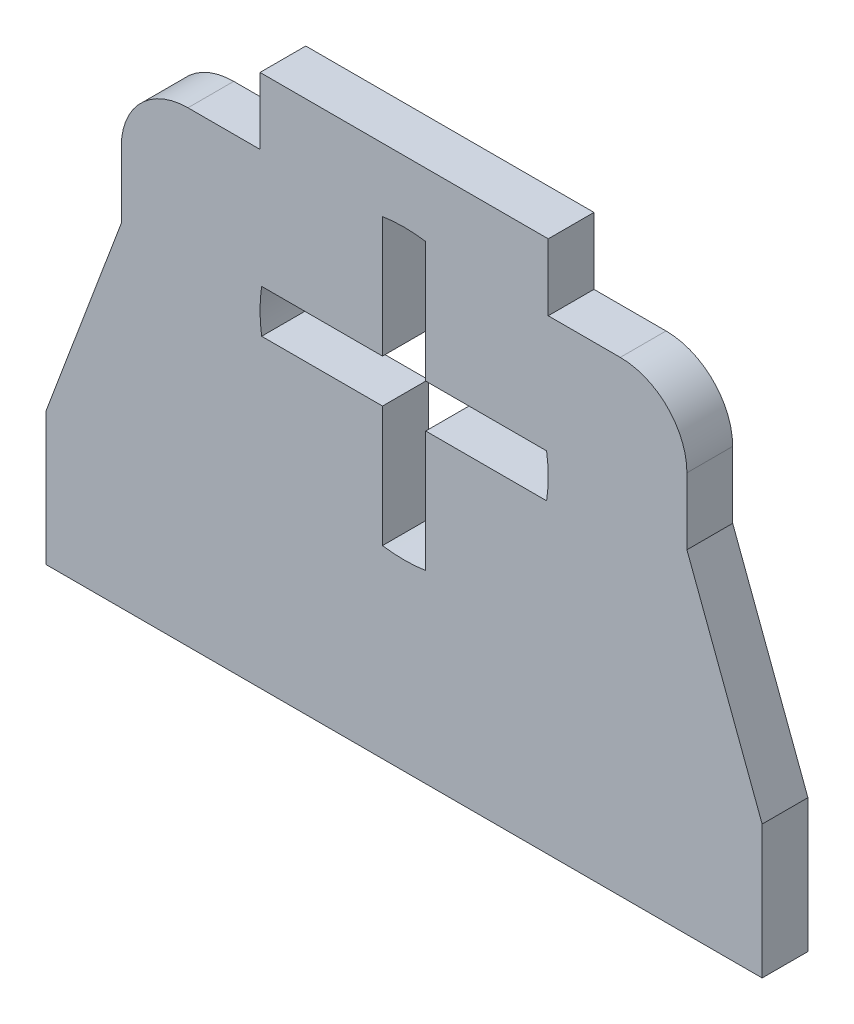
ISO-10303-21;
HEADER;
FILE_DESCRIPTION(('STEP AP214'),'2;1');
FILE_NAME('part.step','',(''),(''),'','','');
FILE_SCHEMA(('AUTOMOTIVE_DESIGN { 1 0 10303 214 1 1 1 1 }'));
ENDSEC;
DATA;
#1=APPLICATION_CONTEXT('core data for automotive mechanical design processes');
#2=APPLICATION_PROTOCOL_DEFINITION('international standard','automotive_design',2000,#1);
#3=PRODUCT_CONTEXT('',#1,'mechanical');
#4=PRODUCT('Part','Part','',(#3));
#5=PRODUCT_RELATED_PRODUCT_CATEGORY('part','',(#4));
#6=PRODUCT_DEFINITION_FORMATION('','',#4);
#7=PRODUCT_DEFINITION_CONTEXT('part definition',#1,'design');
#8=PRODUCT_DEFINITION('design','',#6,#7);
#9=PRODUCT_DEFINITION_SHAPE('','',#8);
#10=(LENGTH_UNIT() NAMED_UNIT(*) SI_UNIT(.MILLI.,.METRE.));
#11=(NAMED_UNIT(*) PLANE_ANGLE_UNIT() SI_UNIT($,.RADIAN.));
#12=(NAMED_UNIT(*) SI_UNIT($,.STERADIAN.) SOLID_ANGLE_UNIT());
#13=UNCERTAINTY_MEASURE_WITH_UNIT(LENGTH_MEASURE(1.E-05),#10,'distance_accuracy_value','');
#14=(GEOMETRIC_REPRESENTATION_CONTEXT(3) GLOBAL_UNCERTAINTY_ASSIGNED_CONTEXT((#13)) GLOBAL_UNIT_ASSIGNED_CONTEXT((#10,
#11,#12)) REPRESENTATION_CONTEXT('',''));
#15=CARTESIAN_POINT('',(0.,0.,0.));
#16=DIRECTION('',(0.,0.,1.));
#17=DIRECTION('',(1.,0.,0.));
#18=AXIS2_PLACEMENT_3D('',#15,#16,#17);
#19=CARTESIAN_POINT('',(-19.845,12.7,-1.5875));
#20=DIRECTION('',(0.,0.,1.));
#21=DIRECTION('',(1.,0.,0.));
#22=AXIS2_PLACEMENT_3D('',#19,#20,#21);
#23=PLANE('',#22);
#24=DIRECTION('',(0.,1.,0.));
#25=VECTOR('',#24,1.);
#26=CARTESIAN_POINT('',(-24.845,0.,-1.5875));
#27=LINE('',#26,#25);
#28=CARTESIAN_POINT('',(-24.845,0.,-1.5875));
#29=VERTEX_POINT('',#28);
#30=CARTESIAN_POINT('',(-24.845,9.24999999999998,-1.5875));
#31=VERTEX_POINT('',#30);
#32=EDGE_CURVE('E383',#29,#31,#27,.T.);
#33=ORIENTED_EDGE('',*,*,#32,.T.);
#34=DIRECTION('',(0.352121223885619,0.935954402569534,0.));
#35=VECTOR('',#34,1.);
#36=CARTESIAN_POINT('',(-24.8130014824992,9.33505353071322,-1.5875));
#37=LINE('',#36,#35);
#38=CARTESIAN_POINT('',(-19.625,23.125,-1.5875));
#39=VERTEX_POINT('',#38);
#40=EDGE_CURVE('E302',#31,#39,#37,.T.);
#41=ORIENTED_EDGE('',*,*,#40,.T.);
#42=DIRECTION('',(0.,-1.,0.));
#43=VECTOR('',#42,1.);
#44=CARTESIAN_POINT('',(-19.625,0.,-1.5875));
#45=LINE('',#44,#43);
#46=CARTESIAN_POINT('',(-19.625,27.75,-1.5875));
#47=VERTEX_POINT('',#46);
#48=EDGE_CURVE('E305',#47,#39,#45,.T.);
#49=ORIENTED_EDGE('',*,*,#48,.F.);
#50=CARTESIAN_POINT('',(-15.,27.75,-1.5875));
#51=DIRECTION('',(0.,0.,1.));
#52=DIRECTION('',(1.,0.,0.));
#53=AXIS2_PLACEMENT_3D('',#50,#51,#52);
#54=CIRCLE('',#53,4.625);
#55=CARTESIAN_POINT('',(-15.,32.375,-1.5875));
#56=VERTEX_POINT('',#55);
#57=EDGE_CURVE('E294',#56,#47,#54,.T.);
#58=ORIENTED_EDGE('',*,*,#57,.F.);
#59=DIRECTION('',(1.,0.,0.));
#60=VECTOR('',#59,1.);
#61=CARTESIAN_POINT('',(0.,32.375,-1.5875));
#62=LINE('',#61,#60);
#63=CARTESIAN_POINT('',(-10.,32.375,-1.5875));
#64=VERTEX_POINT('',#63);
#65=EDGE_CURVE('E296',#56,#64,#62,.T.);
#66=ORIENTED_EDGE('',*,*,#65,.T.);
#67=DIRECTION('',(0.,-1.,0.));
#68=VECTOR('',#67,1.);
#69=CARTESIAN_POINT('',(-10.,0.,-1.5875));
#70=LINE('',#69,#68);
#71=CARTESIAN_POINT('',(-10.,37.,-1.5875));
#72=VERTEX_POINT('',#71);
#73=EDGE_CURVE('E300',#72,#64,#70,.T.);
#74=ORIENTED_EDGE('',*,*,#73,.F.);
#75=DIRECTION('',(-1.,0.,0.));
#76=VECTOR('',#75,1.);
#77=CARTESIAN_POINT('',(0.,37.,-1.5875));
#78=LINE('',#77,#76);
#79=CARTESIAN_POINT('',(10.,37.,-1.5875));
#80=VERTEX_POINT('',#79);
#81=EDGE_CURVE('E379',#80,#72,#78,.T.);
#82=ORIENTED_EDGE('',*,*,#81,.F.);
#83=DIRECTION('',(0.,-1.,0.));
#84=VECTOR('',#83,1.);
#85=CARTESIAN_POINT('',(10.,0.,-1.5875));
#86=LINE('',#85,#84);
#87=CARTESIAN_POINT('',(10.,32.375,-1.5875));
#88=VERTEX_POINT('',#87);
#89=EDGE_CURVE('E349',#80,#88,#86,.T.);
#90=ORIENTED_EDGE('',*,*,#89,.T.);
#91=DIRECTION('',(1.,0.,0.));
#92=VECTOR('',#91,1.);
#93=CARTESIAN_POINT('',(0.,32.375,-1.5875));
#94=LINE('',#93,#92);
#95=CARTESIAN_POINT('',(15.,32.375,-1.5875));
#96=VERTEX_POINT('',#95);
#97=EDGE_CURVE('E337',#88,#96,#94,.T.);
#98=ORIENTED_EDGE('',*,*,#97,.T.);
#99=CARTESIAN_POINT('',(15.,27.75,-1.5875));
#100=DIRECTION('',(0.,0.,1.));
#101=DIRECTION('',(1.,0.,0.));
#102=AXIS2_PLACEMENT_3D('',#99,#100,#101);
#103=CIRCLE('',#102,4.625);
#104=CARTESIAN_POINT('',(19.625,27.75,-1.5875));
#105=VERTEX_POINT('',#104);
#106=EDGE_CURVE('E340',#96,#105,#103,.F.);
#107=ORIENTED_EDGE('',*,*,#106,.T.);
#108=DIRECTION('',(0.,1.,0.));
#109=VECTOR('',#108,1.);
#110=CARTESIAN_POINT('',(19.625,0.,-1.5875));
#111=LINE('',#110,#109);
#112=CARTESIAN_POINT('',(19.625,23.125,-1.5875));
#113=VERTEX_POINT('',#112);
#114=EDGE_CURVE('E344',#113,#105,#111,.T.);
#115=ORIENTED_EDGE('',*,*,#114,.F.);
#116=DIRECTION('',(0.352121223885619,-0.935954402569534,0.));
#117=VECTOR('',#116,1.);
#118=CARTESIAN_POINT('',(24.8130014824992,9.33505353071322,-1.5875));
#119=LINE('',#118,#117);
#120=CARTESIAN_POINT('',(24.845,9.24999999999998,-1.5875));
#121=VERTEX_POINT('',#120);
#122=EDGE_CURVE('E346',#113,#121,#119,.T.);
#123=ORIENTED_EDGE('',*,*,#122,.T.);
#124=DIRECTION('',(0.,1.,0.));
#125=VECTOR('',#124,1.);
#126=CARTESIAN_POINT('',(24.845,0.,-1.5875));
#127=LINE('',#126,#125);
#128=CARTESIAN_POINT('',(24.845,0.,-1.5875));
#129=VERTEX_POINT('',#128);
#130=EDGE_CURVE('E376',#129,#121,#127,.T.);
#131=ORIENTED_EDGE('',*,*,#130,.F.);
#132=DIRECTION('',(-1.,0.,0.));
#133=VECTOR('',#132,1.);
#134=CARTESIAN_POINT('',(-19.845,0.,-1.5875));
#135=LINE('',#134,#133);
#136=EDGE_CURVE('E43',#129,#29,#135,.T.);
#137=ORIENTED_EDGE('',*,*,#136,.T.);
#138=EDGE_LOOP('',(#33,#41,#49,#58,#66,#74,#82,#90,#98,#107,#115,#123,#131,#137));
#139=FACE_BOUND('',#138,.T.);
#140=DIRECTION('',(0.,-1.,0.));
#141=VECTOR('',#140,1.);
#142=CARTESIAN_POINT('',(1.5,0.,-1.5875));
#143=LINE('',#142,#141);
#144=CARTESIAN_POINT('',(1.5,32.5868599666426,-1.5875));
#145=VERTEX_POINT('',#144);
#146=CARTESIAN_POINT('',(1.5,24.2,-1.5875));
#147=VERTEX_POINT('',#146);
#148=EDGE_CURVE('E210',#145,#147,#143,.T.);
#149=ORIENTED_EDGE('',*,*,#148,.F.);
#150=CARTESIAN_POINT('',(0.,22.7,-1.5875));
#151=DIRECTION('',(0.,0.,1.));
#152=DIRECTION('',(1.,0.,0.));
#153=AXIS2_PLACEMENT_3D('',#150,#151,#152);
#154=CIRCLE('',#153,10.);
#155=CARTESIAN_POINT('',(-1.5,32.5868599666426,-1.5875));
#156=VERTEX_POINT('',#155);
#157=EDGE_CURVE('E219',#145,#156,#154,.T.);
#158=ORIENTED_EDGE('',*,*,#157,.T.);
#159=DIRECTION('',(0.,-1.,0.));
#160=VECTOR('',#159,1.);
#161=CARTESIAN_POINT('',(-1.5,0.,-1.5875));
#162=LINE('',#161,#160);
#163=CARTESIAN_POINT('',(-1.5,24.2,-1.5875));
#164=VERTEX_POINT('',#163);
#165=EDGE_CURVE('E50',#156,#164,#162,.T.);
#166=ORIENTED_EDGE('',*,*,#165,.T.);
#167=DIRECTION('',(1.,0.,0.));
#168=VECTOR('',#167,1.);
#169=CARTESIAN_POINT('',(0.,24.2,-1.5875));
#170=LINE('',#169,#168);
#171=CARTESIAN_POINT('',(-9.8868599666426,24.2,-1.5875));
#172=VERTEX_POINT('',#171);
#173=EDGE_CURVE('E234',#172,#164,#170,.T.);
#174=ORIENTED_EDGE('',*,*,#173,.F.);
#175=CARTESIAN_POINT('',(-9.8868599666426,21.2,-1.5875));
#176=VERTEX_POINT('',#175);
#177=EDGE_CURVE('E224',#172,#176,#154,.T.);
#178=ORIENTED_EDGE('',*,*,#177,.T.);
#179=DIRECTION('',(1.,0.,0.));
#180=VECTOR('',#179,1.);
#181=CARTESIAN_POINT('',(0.,21.2,-1.5875));
#182=LINE('',#181,#180);
#183=CARTESIAN_POINT('',(-1.5,21.2,-1.5875));
#184=VERTEX_POINT('',#183);
#185=EDGE_CURVE('E236',#176,#184,#182,.T.);
#186=ORIENTED_EDGE('',*,*,#185,.T.);
#187=DIRECTION('',(0.,-1.,0.));
#188=VECTOR('',#187,1.);
#189=CARTESIAN_POINT('',(-1.5,0.,-1.5875));
#190=LINE('',#189,#188);
#191=CARTESIAN_POINT('',(-1.5,12.8131400333574,-1.5875));
#192=VERTEX_POINT('',#191);
#193=EDGE_CURVE('E239',#184,#192,#190,.T.);
#194=ORIENTED_EDGE('',*,*,#193,.T.);
#195=CARTESIAN_POINT('',(1.5,12.8131400333574,-1.5875));
#196=VERTEX_POINT('',#195);
#197=EDGE_CURVE('E242',#192,#196,#154,.T.);
#198=ORIENTED_EDGE('',*,*,#197,.T.);
#199=DIRECTION('',(0.,-1.,0.));
#200=VECTOR('',#199,1.);
#201=CARTESIAN_POINT('',(1.5,0.,-1.5875));
#202=LINE('',#201,#200);
#203=CARTESIAN_POINT('',(1.5,21.2,-1.5875));
#204=VERTEX_POINT('',#203);
#205=EDGE_CURVE('E243',#204,#196,#202,.T.);
#206=ORIENTED_EDGE('',*,*,#205,.F.);
#207=DIRECTION('',(1.,0.,0.));
#208=VECTOR('',#207,1.);
#209=CARTESIAN_POINT('',(0.,21.2,-1.5875));
#210=LINE('',#209,#208);
#211=CARTESIAN_POINT('',(9.8868599666426,21.2,-1.5875));
#212=VERTEX_POINT('',#211);
#213=EDGE_CURVE('E245',#204,#212,#210,.T.);
#214=ORIENTED_EDGE('',*,*,#213,.T.);
#215=CARTESIAN_POINT('',(9.8868599666426,24.2,-1.5875));
#216=VERTEX_POINT('',#215);
#217=EDGE_CURVE('E223',#212,#216,#154,.T.);
#218=ORIENTED_EDGE('',*,*,#217,.T.);
#219=DIRECTION('',(1.,0.,0.));
#220=VECTOR('',#219,1.);
#221=CARTESIAN_POINT('',(0.,24.2,-1.5875));
#222=LINE('',#221,#220);
#223=EDGE_CURVE('E216',#147,#216,#222,.T.);
#224=ORIENTED_EDGE('',*,*,#223,.F.);
#225=EDGE_LOOP('',(#149,#158,#166,#174,#178,#186,#194,#198,#206,#214,#218,#224));
#226=FACE_BOUND('',#225,.T.);
#227=ADVANCED_FACE('F36',(#139,#226),#23,.F.);
#228=CARTESIAN_POINT('',(-19.845,12.7,1.5875));
#229=DIRECTION('',(0.,0.,-1.));
#230=DIRECTION('',(-1.,0.,0.));
#231=AXIS2_PLACEMENT_3D('',#228,#229,#230);
#232=PLANE('',#231);
#233=DIRECTION('',(0.,-1.,0.));
#234=VECTOR('',#233,1.);
#235=CARTESIAN_POINT('',(-19.625,0.,1.5875));
#236=LINE('',#235,#234);
#237=CARTESIAN_POINT('',(-19.625,27.75,1.5875));
#238=VERTEX_POINT('',#237);
#239=CARTESIAN_POINT('',(-19.625,23.125,1.5875));
#240=VERTEX_POINT('',#239);
#241=EDGE_CURVE('E297',#238,#240,#236,.T.);
#242=ORIENTED_EDGE('',*,*,#241,.T.);
#243=DIRECTION('',(0.352121223885619,0.935954402569534,0.));
#244=VECTOR('',#243,1.);
#245=CARTESIAN_POINT('',(-24.8130014824992,9.33505353071322,1.5875));
#246=LINE('',#245,#244);
#247=CARTESIAN_POINT('',(-24.845,9.24999999999998,1.5875));
#248=VERTEX_POINT('',#247);
#249=EDGE_CURVE('E318',#248,#240,#246,.T.);
#250=ORIENTED_EDGE('',*,*,#249,.F.);
#251=DIRECTION('',(0.,1.,0.));
#252=VECTOR('',#251,1.);
#253=CARTESIAN_POINT('',(-24.845,0.,1.5875));
#254=LINE('',#253,#252);
#255=CARTESIAN_POINT('',(-24.845,0.,1.5875));
#256=VERTEX_POINT('',#255);
#257=EDGE_CURVE('E380',#256,#248,#254,.T.);
#258=ORIENTED_EDGE('',*,*,#257,.F.);
#259=DIRECTION('',(1.,0.,0.));
#260=VECTOR('',#259,1.);
#261=CARTESIAN_POINT('',(-19.845,0.,1.5875));
#262=LINE('',#261,#260);
#263=CARTESIAN_POINT('',(24.845,0.,1.5875));
#264=VERTEX_POINT('',#263);
#265=EDGE_CURVE('E11',#256,#264,#262,.T.);
#266=ORIENTED_EDGE('',*,*,#265,.T.);
#267=DIRECTION('',(0.,1.,0.));
#268=VECTOR('',#267,1.);
#269=CARTESIAN_POINT('',(24.845,0.,1.5875));
#270=LINE('',#269,#268);
#271=CARTESIAN_POINT('',(24.845,9.24999999999998,1.5875));
#272=VERTEX_POINT('',#271);
#273=EDGE_CURVE('E326',#264,#272,#270,.T.);
#274=ORIENTED_EDGE('',*,*,#273,.T.);
#275=DIRECTION('',(0.352121223885619,-0.935954402569534,0.));
#276=VECTOR('',#275,1.);
#277=CARTESIAN_POINT('',(24.8130014824992,9.33505353071322,1.5875));
#278=LINE('',#277,#276);
#279=CARTESIAN_POINT('',(19.625,23.125,1.5875));
#280=VERTEX_POINT('',#279);
#281=EDGE_CURVE('E361',#280,#272,#278,.T.);
#282=ORIENTED_EDGE('',*,*,#281,.F.);
#283=DIRECTION('',(0.,1.,0.));
#284=VECTOR('',#283,1.);
#285=CARTESIAN_POINT('',(19.625,0.,1.5875));
#286=LINE('',#285,#284);
#287=CARTESIAN_POINT('',(19.625,27.75,1.5875));
#288=VERTEX_POINT('',#287);
#289=EDGE_CURVE('E358',#280,#288,#286,.T.);
#290=ORIENTED_EDGE('',*,*,#289,.T.);
#291=CARTESIAN_POINT('',(15.,27.75,1.5875));
#292=DIRECTION('',(0.,0.,1.));
#293=DIRECTION('',(1.,0.,0.));
#294=AXIS2_PLACEMENT_3D('',#291,#292,#293);
#295=CIRCLE('',#294,4.625);
#296=CARTESIAN_POINT('',(15.,32.375,1.5875));
#297=VERTEX_POINT('',#296);
#298=EDGE_CURVE('E355',#297,#288,#295,.F.);
#299=ORIENTED_EDGE('',*,*,#298,.F.);
#300=DIRECTION('',(1.,0.,0.));
#301=VECTOR('',#300,1.);
#302=CARTESIAN_POINT('',(0.,32.375,1.5875));
#303=LINE('',#302,#301);
#304=CARTESIAN_POINT('',(10.,32.375,1.5875));
#305=VERTEX_POINT('',#304);
#306=EDGE_CURVE('E274',#305,#297,#303,.T.);
#307=ORIENTED_EDGE('',*,*,#306,.F.);
#308=DIRECTION('',(0.,-1.,0.));
#309=VECTOR('',#308,1.);
#310=CARTESIAN_POINT('',(10.,0.,1.5875));
#311=LINE('',#310,#309);
#312=CARTESIAN_POINT('',(10.,37.,1.5875));
#313=VERTEX_POINT('',#312);
#314=EDGE_CURVE('E341',#313,#305,#311,.T.);
#315=ORIENTED_EDGE('',*,*,#314,.F.);
#316=DIRECTION('',(-1.,0.,0.));
#317=VECTOR('',#316,1.);
#318=CARTESIAN_POINT('',(0.,37.,1.5875));
#319=LINE('',#318,#317);
#320=CARTESIAN_POINT('',(-10.,37.,1.5875));
#321=VERTEX_POINT('',#320);
#322=EDGE_CURVE('E389',#313,#321,#319,.T.);
#323=ORIENTED_EDGE('',*,*,#322,.T.);
#324=DIRECTION('',(0.,-1.,0.));
#325=VECTOR('',#324,1.);
#326=CARTESIAN_POINT('',(-10.,0.,1.5875));
#327=LINE('',#326,#325);
#328=CARTESIAN_POINT('',(-10.,32.375,1.5875));
#329=VERTEX_POINT('',#328);
#330=EDGE_CURVE('E315',#321,#329,#327,.T.);
#331=ORIENTED_EDGE('',*,*,#330,.T.);
#332=DIRECTION('',(1.,0.,0.));
#333=VECTOR('',#332,1.);
#334=CARTESIAN_POINT('',(0.,32.375,1.5875));
#335=LINE('',#334,#333);
#336=CARTESIAN_POINT('',(-15.,32.375,1.5875));
#337=VERTEX_POINT('',#336);
#338=EDGE_CURVE('E311',#337,#329,#335,.T.);
#339=ORIENTED_EDGE('',*,*,#338,.F.);
#340=CARTESIAN_POINT('',(-15.,27.75,1.5875));
#341=DIRECTION('',(0.,0.,1.));
#342=DIRECTION('',(1.,0.,0.));
#343=AXIS2_PLACEMENT_3D('',#340,#341,#342);
#344=CIRCLE('',#343,4.625);
#345=EDGE_CURVE('E308',#337,#238,#344,.T.);
#346=ORIENTED_EDGE('',*,*,#345,.T.);
#347=EDGE_LOOP('',(#242,#250,#258,#266,#274,#282,#290,#299,#307,#315,#323,#331,#339,#346));
#348=FACE_BOUND('',#347,.T.);
#349=DIRECTION('',(0.,-1.,0.));
#350=VECTOR('',#349,1.);
#351=CARTESIAN_POINT('',(1.5,0.,1.5875));
#352=LINE('',#351,#350);
#353=CARTESIAN_POINT('',(1.5,32.5868599666426,1.5875));
#354=VERTEX_POINT('',#353);
#355=CARTESIAN_POINT('',(1.5,24.2,1.5875));
#356=VERTEX_POINT('',#355);
#357=EDGE_CURVE('E58',#354,#356,#352,.T.);
#358=ORIENTED_EDGE('',*,*,#357,.T.);
#359=DIRECTION('',(1.,0.,0.));
#360=VECTOR('',#359,1.);
#361=CARTESIAN_POINT('',(0.,24.2,1.5875));
#362=LINE('',#361,#360);
#363=CARTESIAN_POINT('',(9.8868599666426,24.2,1.5875));
#364=VERTEX_POINT('',#363);
#365=EDGE_CURVE('E227',#356,#364,#362,.T.);
#366=ORIENTED_EDGE('',*,*,#365,.T.);
#367=CARTESIAN_POINT('',(0.,22.7,1.5875));
#368=DIRECTION('',(0.,0.,1.));
#369=DIRECTION('',(1.,0.,0.));
#370=AXIS2_PLACEMENT_3D('',#367,#368,#369);
#371=CIRCLE('',#370,10.);
#372=CARTESIAN_POINT('',(9.8868599666426,21.2,1.5875));
#373=VERTEX_POINT('',#372);
#374=EDGE_CURVE('E230',#373,#364,#371,.T.);
#375=ORIENTED_EDGE('',*,*,#374,.F.);
#376=DIRECTION('',(1.,0.,0.));
#377=VECTOR('',#376,1.);
#378=CARTESIAN_POINT('',(0.,21.2,1.5875));
#379=LINE('',#378,#377);
#380=CARTESIAN_POINT('',(1.5,21.2,1.5875));
#381=VERTEX_POINT('',#380);
#382=EDGE_CURVE('E269',#381,#373,#379,.T.);
#383=ORIENTED_EDGE('',*,*,#382,.F.);
#384=DIRECTION('',(0.,-1.,0.));
#385=VECTOR('',#384,1.);
#386=CARTESIAN_POINT('',(1.5,0.,1.5875));
#387=LINE('',#386,#385);
#388=CARTESIAN_POINT('',(1.5,12.8131400333574,1.5875));
#389=VERTEX_POINT('',#388);
#390=EDGE_CURVE('E266',#381,#389,#387,.T.);
#391=ORIENTED_EDGE('',*,*,#390,.T.);
#392=CARTESIAN_POINT('',(-1.5,12.8131400333574,1.5875));
#393=VERTEX_POINT('',#392);
#394=EDGE_CURVE('E265',#393,#389,#371,.T.);
#395=ORIENTED_EDGE('',*,*,#394,.F.);
#396=DIRECTION('',(0.,-1.,0.));
#397=VECTOR('',#396,1.);
#398=CARTESIAN_POINT('',(-1.5,0.,1.5875));
#399=LINE('',#398,#397);
#400=CARTESIAN_POINT('',(-1.5,21.2,1.5875));
#401=VERTEX_POINT('',#400);
#402=EDGE_CURVE('E262',#401,#393,#399,.T.);
#403=ORIENTED_EDGE('',*,*,#402,.F.);
#404=DIRECTION('',(1.,0.,0.));
#405=VECTOR('',#404,1.);
#406=CARTESIAN_POINT('',(0.,21.2,1.5875));
#407=LINE('',#406,#405);
#408=CARTESIAN_POINT('',(-9.8868599666426,21.2,1.5875));
#409=VERTEX_POINT('',#408);
#410=EDGE_CURVE('E259',#409,#401,#407,.T.);
#411=ORIENTED_EDGE('',*,*,#410,.F.);
#412=CARTESIAN_POINT('',(-9.8868599666426,24.2,1.5875));
#413=VERTEX_POINT('',#412);
#414=EDGE_CURVE('E253',#413,#409,#371,.T.);
#415=ORIENTED_EDGE('',*,*,#414,.F.);
#416=DIRECTION('',(1.,0.,0.));
#417=VECTOR('',#416,1.);
#418=CARTESIAN_POINT('',(0.,24.2,1.5875));
#419=LINE('',#418,#417);
#420=CARTESIAN_POINT('',(-1.5,24.2,1.5875));
#421=VERTEX_POINT('',#420);
#422=EDGE_CURVE('E256',#413,#421,#419,.T.);
#423=ORIENTED_EDGE('',*,*,#422,.T.);
#424=DIRECTION('',(0.,-1.,0.));
#425=VECTOR('',#424,1.);
#426=CARTESIAN_POINT('',(-1.5,0.,1.5875));
#427=LINE('',#426,#425);
#428=CARTESIAN_POINT('',(-1.5,32.5868599666426,1.5875));
#429=VERTEX_POINT('',#428);
#430=EDGE_CURVE('E252',#429,#421,#427,.T.);
#431=ORIENTED_EDGE('',*,*,#430,.F.);
#432=EDGE_CURVE('E250',#354,#429,#371,.T.);
#433=ORIENTED_EDGE('',*,*,#432,.F.);
#434=EDGE_LOOP('',(#358,#366,#375,#383,#391,#395,#403,#411,#415,#423,#431,#433));
#435=FACE_BOUND('',#434,.T.);
#436=ADVANCED_FACE('F414',(#348,#435),#232,.F.);
#437=CARTESIAN_POINT('',(0.,37.,-1.5875));
#438=DIRECTION('',(0.,1.,0.));
#439=DIRECTION('',(0.,0.,1.));
#440=AXIS2_PLACEMENT_3D('',#437,#438,#439);
#441=PLANE('',#440);
#442=ORIENTED_EDGE('',*,*,#81,.T.);
#443=DIRECTION('',(0.,0.,1.));
#444=VECTOR('',#443,1.);
#445=CARTESIAN_POINT('',(-10.,37.,-1.5875));
#446=LINE('',#445,#444);
#447=EDGE_CURVE('E331',#72,#321,#446,.T.);
#448=ORIENTED_EDGE('',*,*,#447,.T.);
#449=ORIENTED_EDGE('',*,*,#322,.F.);
#450=DIRECTION('',(0.,0.,1.));
#451=VECTOR('',#450,1.);
#452=CARTESIAN_POINT('',(10.,37.,-1.5875));
#453=LINE('',#452,#451);
#454=EDGE_CURVE('E366',#80,#313,#453,.T.);
#455=ORIENTED_EDGE('',*,*,#454,.F.);
#456=EDGE_LOOP('',(#442,#448,#449,#455));
#457=FACE_BOUND('',#456,.T.);
#458=ADVANCED_FACE('F435',(#457),#441,.T.);
#459=CARTESIAN_POINT('',(0.,0.,0.));
#460=DIRECTION('',(0.,1.,0.));
#461=DIRECTION('',(0.,0.,1.));
#462=AXIS2_PLACEMENT_3D('',#459,#460,#461);
#463=PLANE('',#462);
#464=ORIENTED_EDGE('',*,*,#136,.F.);
#465=DIRECTION('',(0.,0.,1.));
#466=VECTOR('',#465,1.);
#467=CARTESIAN_POINT('',(24.845,0.,-1.5875));
#468=LINE('',#467,#466);
#469=EDGE_CURVE('E386',#129,#264,#468,.T.);
#470=ORIENTED_EDGE('',*,*,#469,.T.);
#471=ORIENTED_EDGE('',*,*,#265,.F.);
#472=DIRECTION('',(0.,0.,1.));
#473=VECTOR('',#472,1.);
#474=CARTESIAN_POINT('',(-24.845,0.,-1.5875));
#475=LINE('',#474,#473);
#476=EDGE_CURVE('E394',#29,#256,#475,.T.);
#477=ORIENTED_EDGE('',*,*,#476,.F.);
#478=EDGE_LOOP('',(#464,#470,#471,#477));
#479=FACE_BOUND('',#478,.T.);
#480=ADVANCED_FACE('F404',(#479),#463,.F.);
#481=CARTESIAN_POINT('',(-24.845,0.,-1.5875));
#482=DIRECTION('',(1.,0.,0.));
#483=DIRECTION('',(0.,0.,-1.));
#484=AXIS2_PLACEMENT_3D('',#481,#482,#483);
#485=PLANE('',#484);
#486=ORIENTED_EDGE('',*,*,#257,.T.);
#487=DIRECTION('',(0.,0.,1.));
#488=VECTOR('',#487,1.);
#489=CARTESIAN_POINT('',(-24.845,9.24999999999998,-1.5875));
#490=LINE('',#489,#488);
#491=EDGE_CURVE('E329',#31,#248,#490,.T.);
#492=ORIENTED_EDGE('',*,*,#491,.F.);
#493=ORIENTED_EDGE('',*,*,#32,.F.);
#494=ORIENTED_EDGE('',*,*,#476,.T.);
#495=EDGE_LOOP('',(#486,#492,#493,#494));
#496=FACE_BOUND('',#495,.T.);
#497=ADVANCED_FACE('F408',(#496),#485,.F.);
#498=CARTESIAN_POINT('',(24.845,0.,-1.5875));
#499=DIRECTION('',(1.,0.,0.));
#500=DIRECTION('',(0.,0.,-1.));
#501=AXIS2_PLACEMENT_3D('',#498,#499,#500);
#502=PLANE('',#501);
#503=DIRECTION('',(0.,0.,1.));
#504=VECTOR('',#503,1.);
#505=CARTESIAN_POINT('',(24.845,9.24999999999998,-1.5875));
#506=LINE('',#505,#504);
#507=EDGE_CURVE('E368',#121,#272,#506,.T.);
#508=ORIENTED_EDGE('',*,*,#507,.T.);
#509=ORIENTED_EDGE('',*,*,#273,.F.);
#510=ORIENTED_EDGE('',*,*,#469,.F.);
#511=ORIENTED_EDGE('',*,*,#130,.T.);
#512=EDGE_LOOP('',(#508,#509,#510,#511));
#513=FACE_BOUND('',#512,.T.);
#514=ADVANCED_FACE('F457',(#513),#502,.T.);
#515=CARTESIAN_POINT('',(0.,32.375,-1.5875));
#516=DIRECTION('',(0.,-1.,0.));
#517=DIRECTION('',(0.,0.,-1.));
#518=AXIS2_PLACEMENT_3D('',#515,#516,#517);
#519=PLANE('',#518);
#520=ORIENTED_EDGE('',*,*,#306,.T.);
#521=DIRECTION('',(0.,0.,1.));
#522=VECTOR('',#521,1.);
#523=CARTESIAN_POINT('',(15.,32.375,-1.5875));
#524=LINE('',#523,#522);
#525=EDGE_CURVE('E352',#96,#297,#524,.T.);
#526=ORIENTED_EDGE('',*,*,#525,.F.);
#527=ORIENTED_EDGE('',*,*,#97,.F.);
#528=DIRECTION('',(0.,0.,1.));
#529=VECTOR('',#528,1.);
#530=CARTESIAN_POINT('',(10.,32.375,-1.5875));
#531=LINE('',#530,#529);
#532=EDGE_CURVE('E312',#88,#305,#531,.T.);
#533=ORIENTED_EDGE('',*,*,#532,.T.);
#534=EDGE_LOOP('',(#520,#526,#527,#533));
#535=FACE_BOUND('',#534,.T.);
#536=ADVANCED_FACE('F446',(#535),#519,.F.);
#537=CARTESIAN_POINT('',(10.,0.,-1.5875));
#538=DIRECTION('',(-1.,0.,0.));
#539=DIRECTION('',(0.,-1.,0.));
#540=AXIS2_PLACEMENT_3D('',#537,#538,#539);
#541=PLANE('',#540);
#542=ORIENTED_EDGE('',*,*,#314,.T.);
#543=ORIENTED_EDGE('',*,*,#532,.F.);
#544=ORIENTED_EDGE('',*,*,#89,.F.);
#545=ORIENTED_EDGE('',*,*,#454,.T.);
#546=EDGE_LOOP('',(#542,#543,#544,#545));
#547=FACE_BOUND('',#546,.T.);
#548=ADVANCED_FACE('F441',(#547),#541,.F.);
#549=CARTESIAN_POINT('',(24.8130014824992,9.33505353071322,-1.5875));
#550=DIRECTION('',(-0.935954402569534,-0.352121223885619,0.));
#551=DIRECTION('',(0.352121223885619,-0.935954402569534,0.));
#552=AXIS2_PLACEMENT_3D('',#549,#550,#551);
#553=PLANE('',#552);
#554=ORIENTED_EDGE('',*,*,#281,.T.);
#555=ORIENTED_EDGE('',*,*,#507,.F.);
#556=ORIENTED_EDGE('',*,*,#122,.F.);
#557=DIRECTION('',(0.,0.,1.));
#558=VECTOR('',#557,1.);
#559=CARTESIAN_POINT('',(19.625,23.125,-1.5875));
#560=LINE('',#559,#558);
#561=EDGE_CURVE('E371',#113,#280,#560,.T.);
#562=ORIENTED_EDGE('',*,*,#561,.T.);
#563=EDGE_LOOP('',(#554,#555,#556,#562));
#564=FACE_BOUND('',#563,.T.);
#565=ADVANCED_FACE('F459',(#564),#553,.F.);
#566=CARTESIAN_POINT('',(19.625,0.,-1.5875));
#567=DIRECTION('',(1.,0.,0.));
#568=DIRECTION('',(0.,0.,-1.));
#569=AXIS2_PLACEMENT_3D('',#566,#567,#568);
#570=PLANE('',#569);
#571=ORIENTED_EDGE('',*,*,#289,.F.);
#572=ORIENTED_EDGE('',*,*,#561,.F.);
#573=ORIENTED_EDGE('',*,*,#114,.T.);
#574=DIRECTION('',(0.,0.,1.));
#575=VECTOR('',#574,1.);
#576=CARTESIAN_POINT('',(19.625,27.75,-1.5875));
#577=LINE('',#576,#575);
#578=EDGE_CURVE('E373',#105,#288,#577,.T.);
#579=ORIENTED_EDGE('',*,*,#578,.T.);
#580=EDGE_LOOP('',(#571,#572,#573,#579));
#581=FACE_BOUND('',#580,.T.);
#582=ADVANCED_FACE('F452',(#581),#570,.T.);
#583=CARTESIAN_POINT('',(15.,27.75,-1.5875));
#584=DIRECTION('',(0.,0.,1.));
#585=DIRECTION('',(1.,0.,0.));
#586=AXIS2_PLACEMENT_3D('',#583,#584,#585);
#587=CYLINDRICAL_SURFACE('',#586,4.625);
#588=ORIENTED_EDGE('',*,*,#298,.T.);
#589=ORIENTED_EDGE('',*,*,#578,.F.);
#590=ORIENTED_EDGE('',*,*,#106,.F.);
#591=ORIENTED_EDGE('',*,*,#525,.T.);
#592=EDGE_LOOP('',(#588,#589,#590,#591));
#593=FACE_BOUND('',#592,.T.);
#594=ADVANCED_FACE('F449',(#593),#587,.T.);
#595=CARTESIAN_POINT('',(-15.,27.75,-1.5875));
#596=DIRECTION('',(0.,0.,1.));
#597=DIRECTION('',(1.,0.,0.));
#598=AXIS2_PLACEMENT_3D('',#595,#596,#597);
#599=CYLINDRICAL_SURFACE('',#598,4.625);
#600=ORIENTED_EDGE('',*,*,#345,.F.);
#601=DIRECTION('',(0.,0.,1.));
#602=VECTOR('',#601,1.);
#603=CARTESIAN_POINT('',(-15.,32.375,-1.5875));
#604=LINE('',#603,#602);
#605=EDGE_CURVE('E307',#56,#337,#604,.T.);
#606=ORIENTED_EDGE('',*,*,#605,.F.);
#607=ORIENTED_EDGE('',*,*,#57,.T.);
#608=DIRECTION('',(0.,0.,1.));
#609=VECTOR('',#608,1.);
#610=CARTESIAN_POINT('',(-19.625,27.75,-1.5875));
#611=LINE('',#610,#609);
#612=EDGE_CURVE('E323',#47,#238,#611,.T.);
#613=ORIENTED_EDGE('',*,*,#612,.T.);
#614=EDGE_LOOP('',(#600,#606,#607,#613));
#615=FACE_BOUND('',#614,.T.);
#616=ADVANCED_FACE('F423',(#615),#599,.T.);
#617=CARTESIAN_POINT('',(-19.625,0.,-1.5875));
#618=DIRECTION('',(-1.,0.,0.));
#619=DIRECTION('',(0.,0.,1.));
#620=AXIS2_PLACEMENT_3D('',#617,#618,#619);
#621=PLANE('',#620);
#622=ORIENTED_EDGE('',*,*,#241,.F.);
#623=ORIENTED_EDGE('',*,*,#612,.F.);
#624=ORIENTED_EDGE('',*,*,#48,.T.);
#625=DIRECTION('',(0.,0.,1.));
#626=VECTOR('',#625,1.);
#627=CARTESIAN_POINT('',(-19.625,23.125,-1.5875));
#628=LINE('',#627,#626);
#629=EDGE_CURVE('E327',#39,#240,#628,.T.);
#630=ORIENTED_EDGE('',*,*,#629,.T.);
#631=EDGE_LOOP('',(#622,#623,#624,#630));
#632=FACE_BOUND('',#631,.T.);
#633=ADVANCED_FACE('F420',(#632),#621,.T.);
#634=CARTESIAN_POINT('',(-24.8130014824992,9.33505353071322,-1.5875));
#635=DIRECTION('',(0.935954402569534,-0.352121223885619,0.));
#636=DIRECTION('',(0.352121223885619,0.935954402569534,0.));
#637=AXIS2_PLACEMENT_3D('',#634,#635,#636);
#638=PLANE('',#637);
#639=ORIENTED_EDGE('',*,*,#249,.T.);
#640=ORIENTED_EDGE('',*,*,#629,.F.);
#641=ORIENTED_EDGE('',*,*,#40,.F.);
#642=ORIENTED_EDGE('',*,*,#491,.T.);
#643=EDGE_LOOP('',(#639,#640,#641,#642));
#644=FACE_BOUND('',#643,.T.);
#645=ADVANCED_FACE('F411',(#644),#638,.F.);
#646=CARTESIAN_POINT('',(-10.,0.,-1.5875));
#647=DIRECTION('',(-1.,0.,0.));
#648=DIRECTION('',(0.,0.,1.));
#649=AXIS2_PLACEMENT_3D('',#646,#647,#648);
#650=PLANE('',#649);
#651=ORIENTED_EDGE('',*,*,#330,.F.);
#652=ORIENTED_EDGE('',*,*,#447,.F.);
#653=ORIENTED_EDGE('',*,*,#73,.T.);
#654=DIRECTION('',(0.,0.,1.));
#655=VECTOR('',#654,1.);
#656=CARTESIAN_POINT('',(-10.,32.375,-1.5875));
#657=LINE('',#656,#655);
#658=EDGE_CURVE('E334',#64,#329,#657,.T.);
#659=ORIENTED_EDGE('',*,*,#658,.T.);
#660=EDGE_LOOP('',(#651,#652,#653,#659));
#661=FACE_BOUND('',#660,.T.);
#662=ADVANCED_FACE('F432',(#661),#650,.T.);
#663=CARTESIAN_POINT('',(0.,32.375,-1.5875));
#664=DIRECTION('',(0.,-1.,0.));
#665=DIRECTION('',(0.,0.,-1.));
#666=AXIS2_PLACEMENT_3D('',#663,#664,#665);
#667=PLANE('',#666);
#668=ORIENTED_EDGE('',*,*,#338,.T.);
#669=ORIENTED_EDGE('',*,*,#658,.F.);
#670=ORIENTED_EDGE('',*,*,#65,.F.);
#671=ORIENTED_EDGE('',*,*,#605,.T.);
#672=EDGE_LOOP('',(#668,#669,#670,#671));
#673=FACE_BOUND('',#672,.T.);
#674=ADVANCED_FACE('F430',(#673),#667,.F.);
#675=CARTESIAN_POINT('',(1.5,0.,-1.5875));
#676=DIRECTION('',(-1.,0.,0.));
#677=DIRECTION('',(0.,-1.,0.));
#678=AXIS2_PLACEMENT_3D('',#675,#676,#677);
#679=PLANE('',#678);
#680=ORIENTED_EDGE('',*,*,#357,.F.);
#681=DIRECTION('',(0.,0.,1.));
#682=VECTOR('',#681,1.);
#683=CARTESIAN_POINT('',(1.5,32.5868599666426,-1.5875));
#684=LINE('',#683,#682);
#685=EDGE_CURVE('E206',#145,#354,#684,.T.);
#686=ORIENTED_EDGE('',*,*,#685,.F.);
#687=ORIENTED_EDGE('',*,*,#148,.T.);
#688=DIRECTION('',(0.,0.,1.));
#689=VECTOR('',#688,1.);
#690=CARTESIAN_POINT('',(1.5,24.2,-1.5875));
#691=LINE('',#690,#689);
#692=EDGE_CURVE('E272',#147,#356,#691,.T.);
#693=ORIENTED_EDGE('',*,*,#692,.T.);
#694=EDGE_LOOP('',(#680,#686,#687,#693));
#695=FACE_BOUND('',#694,.T.);
#696=ADVANCED_FACE('F208',(#695),#679,.T.);
#697=CARTESIAN_POINT('',(0.,24.2,-1.5875));
#698=DIRECTION('',(0.,-1.,0.));
#699=DIRECTION('',(0.,0.,-1.));
#700=AXIS2_PLACEMENT_3D('',#697,#698,#699);
#701=PLANE('',#700);
#702=ORIENTED_EDGE('',*,*,#365,.F.);
#703=ORIENTED_EDGE('',*,*,#692,.F.);
#704=ORIENTED_EDGE('',*,*,#223,.T.);
#705=DIRECTION('',(0.,0.,1.));
#706=VECTOR('',#705,1.);
#707=CARTESIAN_POINT('',(9.8868599666426,24.2,-1.5875));
#708=LINE('',#707,#706);
#709=EDGE_CURVE('E275',#216,#364,#708,.T.);
#710=ORIENTED_EDGE('',*,*,#709,.T.);
#711=EDGE_LOOP('',(#702,#703,#704,#710));
#712=FACE_BOUND('',#711,.T.);
#713=ADVANCED_FACE('F503',(#712),#701,.T.);
#714=CARTESIAN_POINT('',(0.,22.7,-1.5875));
#715=DIRECTION('',(0.,0.,1.));
#716=DIRECTION('',(1.,0.,0.));
#717=AXIS2_PLACEMENT_3D('',#714,#715,#716);
#718=CYLINDRICAL_SURFACE('',#717,10.);
#719=ORIENTED_EDGE('',*,*,#374,.T.);
#720=ORIENTED_EDGE('',*,*,#709,.F.);
#721=ORIENTED_EDGE('',*,*,#217,.F.);
#722=DIRECTION('',(0.,0.,1.));
#723=VECTOR('',#722,1.);
#724=CARTESIAN_POINT('',(9.8868599666426,21.2,-1.5875));
#725=LINE('',#724,#723);
#726=EDGE_CURVE('E277',#212,#373,#725,.T.);
#727=ORIENTED_EDGE('',*,*,#726,.T.);
#728=EDGE_LOOP('',(#719,#720,#721,#727));
#729=FACE_BOUND('',#728,.T.);
#730=ADVANCED_FACE('F528',(#729),#718,.F.);
#731=CARTESIAN_POINT('',(0.,21.2,-1.5875));
#732=DIRECTION('',(0.,-1.,0.));
#733=DIRECTION('',(0.,0.,-1.));
#734=AXIS2_PLACEMENT_3D('',#731,#732,#733);
#735=PLANE('',#734);
#736=ORIENTED_EDGE('',*,*,#382,.T.);
#737=ORIENTED_EDGE('',*,*,#726,.F.);
#738=ORIENTED_EDGE('',*,*,#213,.F.);
#739=DIRECTION('',(0.,0.,1.));
#740=VECTOR('',#739,1.);
#741=CARTESIAN_POINT('',(1.5,21.2,-1.5875));
#742=LINE('',#741,#740);
#743=EDGE_CURVE('E279',#204,#381,#742,.T.);
#744=ORIENTED_EDGE('',*,*,#743,.T.);
#745=EDGE_LOOP('',(#736,#737,#738,#744));
#746=FACE_BOUND('',#745,.T.);
#747=ADVANCED_FACE('F524',(#746),#735,.F.);
#748=CARTESIAN_POINT('',(1.5,0.,-1.5875));
#749=DIRECTION('',(-1.,0.,0.));
#750=DIRECTION('',(0.,-1.,0.));
#751=AXIS2_PLACEMENT_3D('',#748,#749,#750);
#752=PLANE('',#751);
#753=ORIENTED_EDGE('',*,*,#390,.F.);
#754=ORIENTED_EDGE('',*,*,#743,.F.);
#755=ORIENTED_EDGE('',*,*,#205,.T.);
#756=DIRECTION('',(0.,0.,1.));
#757=VECTOR('',#756,1.);
#758=CARTESIAN_POINT('',(1.5,12.8131400333574,-1.5875));
#759=LINE('',#758,#757);
#760=EDGE_CURVE('E281',#196,#389,#759,.T.);
#761=ORIENTED_EDGE('',*,*,#760,.T.);
#762=EDGE_LOOP('',(#753,#754,#755,#761));
#763=FACE_BOUND('',#762,.T.);
#764=ADVANCED_FACE('F521',(#763),#752,.T.);
#765=ORIENTED_EDGE('',*,*,#394,.T.);
#766=ORIENTED_EDGE('',*,*,#760,.F.);
#767=ORIENTED_EDGE('',*,*,#197,.F.);
#768=DIRECTION('',(0.,0.,1.));
#769=VECTOR('',#768,1.);
#770=CARTESIAN_POINT('',(-1.5,12.8131400333574,-1.5875));
#771=LINE('',#770,#769);
#772=EDGE_CURVE('E283',#192,#393,#771,.T.);
#773=ORIENTED_EDGE('',*,*,#772,.T.);
#774=EDGE_LOOP('',(#765,#766,#767,#773));
#775=FACE_BOUND('',#774,.T.);
#776=ADVANCED_FACE('F519',(#775),#718,.F.);
#777=CARTESIAN_POINT('',(-1.5,0.,-1.5875));
#778=DIRECTION('',(-1.,0.,0.));
#779=DIRECTION('',(0.,-1.,0.));
#780=AXIS2_PLACEMENT_3D('',#777,#778,#779);
#781=PLANE('',#780);
#782=ORIENTED_EDGE('',*,*,#402,.T.);
#783=ORIENTED_EDGE('',*,*,#772,.F.);
#784=ORIENTED_EDGE('',*,*,#193,.F.);
#785=DIRECTION('',(0.,0.,1.));
#786=VECTOR('',#785,1.);
#787=CARTESIAN_POINT('',(-1.5,21.2,-1.5875));
#788=LINE('',#787,#786);
#789=EDGE_CURVE('E285',#184,#401,#788,.T.);
#790=ORIENTED_EDGE('',*,*,#789,.T.);
#791=EDGE_LOOP('',(#782,#783,#784,#790));
#792=FACE_BOUND('',#791,.T.);
#793=ADVANCED_FACE('F515',(#792),#781,.F.);
#794=CARTESIAN_POINT('',(0.,21.2,-1.5875));
#795=DIRECTION('',(0.,-1.,0.));
#796=DIRECTION('',(0.,0.,-1.));
#797=AXIS2_PLACEMENT_3D('',#794,#795,#796);
#798=PLANE('',#797);
#799=ORIENTED_EDGE('',*,*,#410,.T.);
#800=ORIENTED_EDGE('',*,*,#789,.F.);
#801=ORIENTED_EDGE('',*,*,#185,.F.);
#802=DIRECTION('',(0.,0.,1.));
#803=VECTOR('',#802,1.);
#804=CARTESIAN_POINT('',(-9.8868599666426,21.2,-1.5875));
#805=LINE('',#804,#803);
#806=EDGE_CURVE('E287',#176,#409,#805,.T.);
#807=ORIENTED_EDGE('',*,*,#806,.T.);
#808=EDGE_LOOP('',(#799,#800,#801,#807));
#809=FACE_BOUND('',#808,.T.);
#810=ADVANCED_FACE('F512',(#809),#798,.F.);
#811=ORIENTED_EDGE('',*,*,#414,.T.);
#812=ORIENTED_EDGE('',*,*,#806,.F.);
#813=ORIENTED_EDGE('',*,*,#177,.F.);
#814=DIRECTION('',(0.,0.,1.));
#815=VECTOR('',#814,1.);
#816=CARTESIAN_POINT('',(-9.8868599666426,24.2,-1.5875));
#817=LINE('',#816,#815);
#818=EDGE_CURVE('E289',#172,#413,#817,.T.);
#819=ORIENTED_EDGE('',*,*,#818,.T.);
#820=EDGE_LOOP('',(#811,#812,#813,#819));
#821=FACE_BOUND('',#820,.T.);
#822=ADVANCED_FACE('F510',(#821),#718,.F.);
#823=CARTESIAN_POINT('',(0.,24.2,-1.5875));
#824=DIRECTION('',(0.,-1.,0.));
#825=DIRECTION('',(0.,0.,-1.));
#826=AXIS2_PLACEMENT_3D('',#823,#824,#825);
#827=PLANE('',#826);
#828=ORIENTED_EDGE('',*,*,#422,.F.);
#829=ORIENTED_EDGE('',*,*,#818,.F.);
#830=ORIENTED_EDGE('',*,*,#173,.T.);
#831=DIRECTION('',(0.,0.,1.));
#832=VECTOR('',#831,1.);
#833=CARTESIAN_POINT('',(-1.5,24.2,-1.5875));
#834=LINE('',#833,#832);
#835=EDGE_CURVE('E291',#164,#421,#834,.T.);
#836=ORIENTED_EDGE('',*,*,#835,.T.);
#837=EDGE_LOOP('',(#828,#829,#830,#836));
#838=FACE_BOUND('',#837,.T.);
#839=ADVANCED_FACE('F507',(#838),#827,.T.);
#840=CARTESIAN_POINT('',(-1.5,0.,-1.5875));
#841=DIRECTION('',(-1.,0.,0.));
#842=DIRECTION('',(0.,-1.,0.));
#843=AXIS2_PLACEMENT_3D('',#840,#841,#842);
#844=PLANE('',#843);
#845=ORIENTED_EDGE('',*,*,#430,.T.);
#846=ORIENTED_EDGE('',*,*,#835,.F.);
#847=ORIENTED_EDGE('',*,*,#165,.F.);
#848=DIRECTION('',(0.,0.,1.));
#849=VECTOR('',#848,1.);
#850=CARTESIAN_POINT('',(-1.5,32.5868599666426,-1.5875));
#851=LINE('',#850,#849);
#852=EDGE_CURVE('E215',#156,#429,#851,.T.);
#853=ORIENTED_EDGE('',*,*,#852,.T.);
#854=EDGE_LOOP('',(#845,#846,#847,#853));
#855=FACE_BOUND('',#854,.T.);
#856=ADVANCED_FACE('F504',(#855),#844,.F.);
#857=ORIENTED_EDGE('',*,*,#432,.T.);
#858=ORIENTED_EDGE('',*,*,#852,.F.);
#859=ORIENTED_EDGE('',*,*,#157,.F.);
#860=ORIENTED_EDGE('',*,*,#685,.T.);
#861=EDGE_LOOP('',(#857,#858,#859,#860));
#862=FACE_BOUND('',#861,.T.);
#863=ADVANCED_FACE('F220',(#862),#718,.F.);
#864=CLOSED_SHELL('',(#227,#436,#458,#480,#497,#514,#536,#548,#565,#582,#594,#616,#633,#645,
#662,#674,#696,#713,#730,#747,#764,#776,#793,#810,#822,#839,#856,#863));
#865=MANIFOLD_SOLID_BREP('B2',#864);
#866=ADVANCED_BREP_SHAPE_REPRESENTATION('',(#18,#865),#14);
#867=SHAPE_DEFINITION_REPRESENTATION(#9,#866);
ENDSEC;
END-ISO-10303-21;
